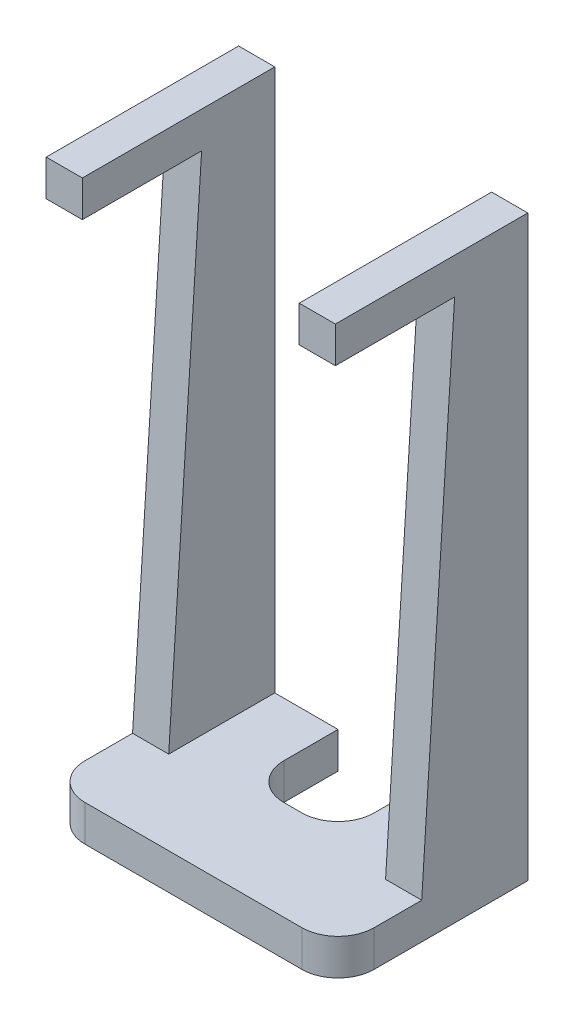
ISO-10303-21;
HEADER;
FILE_DESCRIPTION(('STEP AP214'),'2;1');
FILE_NAME('part.step','',(''),(''),'','','');
FILE_SCHEMA(('AUTOMOTIVE_DESIGN { 1 0 10303 214 1 1 1 1 }'));
ENDSEC;
DATA;
#1=APPLICATION_CONTEXT('core data for automotive mechanical design processes');
#2=APPLICATION_PROTOCOL_DEFINITION('international standard','automotive_design',2000,#1);
#3=PRODUCT_CONTEXT('',#1,'mechanical');
#4=PRODUCT('Part','Part','',(#3));
#5=PRODUCT_RELATED_PRODUCT_CATEGORY('part','',(#4));
#6=PRODUCT_DEFINITION_FORMATION('','',#4);
#7=PRODUCT_DEFINITION_CONTEXT('part definition',#1,'design');
#8=PRODUCT_DEFINITION('design','',#6,#7);
#9=PRODUCT_DEFINITION_SHAPE('','',#8);
#10=(LENGTH_UNIT() NAMED_UNIT(*) SI_UNIT(.MILLI.,.METRE.));
#11=(NAMED_UNIT(*) PLANE_ANGLE_UNIT() SI_UNIT($,.RADIAN.));
#12=(NAMED_UNIT(*) SI_UNIT($,.STERADIAN.) SOLID_ANGLE_UNIT());
#13=UNCERTAINTY_MEASURE_WITH_UNIT(LENGTH_MEASURE(1.E-05),#10,'distance_accuracy_value','');
#14=(GEOMETRIC_REPRESENTATION_CONTEXT(3) GLOBAL_UNCERTAINTY_ASSIGNED_CONTEXT((#13)) GLOBAL_UNIT_ASSIGNED_CONTEXT((#10,
#11,#12)) REPRESENTATION_CONTEXT('',''));
#15=CARTESIAN_POINT('',(0.,0.,0.));
#16=DIRECTION('',(0.,0.,1.));
#17=DIRECTION('',(1.,0.,0.));
#18=AXIS2_PLACEMENT_3D('',#15,#16,#17);
#19=CARTESIAN_POINT('',(-8.,2.,-5.25));
#20=DIRECTION('',(0.,0.,1.));
#21=DIRECTION('',(1.,0.,0.));
#22=AXIS2_PLACEMENT_3D('',#19,#20,#21);
#23=PLANE('',#22);
#24=DIRECTION('',(-1.,0.,0.));
#25=VECTOR('',#24,1.);
#26=CARTESIAN_POINT('',(-8.,0.,-5.25));
#27=LINE('',#26,#25);
#28=CARTESIAN_POINT('',(8.,0.,-5.25));
#29=VERTEX_POINT('',#28);
#30=CARTESIAN_POINT('',(2.5,0.,-5.25));
#31=VERTEX_POINT('',#30);
#32=EDGE_CURVE('E207',#29,#31,#27,.T.);
#33=ORIENTED_EDGE('',*,*,#32,.T.);
#34=DIRECTION('',(0.,-1.,0.));
#35=VECTOR('',#34,1.);
#36=CARTESIAN_POINT('',(2.5,32.,-5.25));
#37=LINE('',#36,#35);
#38=CARTESIAN_POINT('',(2.5,2.,-5.25));
#39=VERTEX_POINT('',#38);
#40=EDGE_CURVE('E201',#39,#31,#37,.T.);
#41=ORIENTED_EDGE('',*,*,#40,.F.);
#42=DIRECTION('',(-1.,0.,0.));
#43=VECTOR('',#42,1.);
#44=CARTESIAN_POINT('',(-8.,2.,-5.25));
#45=LINE('',#44,#43);
#46=CARTESIAN_POINT('',(6.,2.,-5.25));
#47=VERTEX_POINT('',#46);
#48=EDGE_CURVE('E514',#47,#39,#45,.T.);
#49=ORIENTED_EDGE('',*,*,#48,.F.);
#50=DIRECTION('',(0.,1.,0.));
#51=VECTOR('',#50,1.);
#52=CARTESIAN_POINT('',(6.,0.,-5.25));
#53=LINE('',#52,#51);
#54=CARTESIAN_POINT('',(6.,32.,-5.25));
#55=VERTEX_POINT('',#54);
#56=EDGE_CURVE('E537',#47,#55,#53,.T.);
#57=ORIENTED_EDGE('',*,*,#56,.T.);
#58=DIRECTION('',(1.,0.,0.));
#59=VECTOR('',#58,1.);
#60=CARTESIAN_POINT('',(6.,32.,-5.25));
#61=LINE('',#60,#59);
#62=CARTESIAN_POINT('',(8.,32.,-5.25));
#63=VERTEX_POINT('',#62);
#64=EDGE_CURVE('E525',#55,#63,#61,.T.);
#65=ORIENTED_EDGE('',*,*,#64,.T.);
#66=DIRECTION('',(0.,-1.,0.));
#67=VECTOR('',#66,1.);
#68=CARTESIAN_POINT('',(8.,2.,-5.25));
#69=LINE('',#68,#67);
#70=EDGE_CURVE('E222',#63,#29,#69,.T.);
#71=ORIENTED_EDGE('',*,*,#70,.T.);
#72=EDGE_LOOP('',(#33,#41,#49,#57,#65,#71));
#73=FACE_BOUND('',#72,.T.);
#74=ADVANCED_FACE('F33',(#73),#23,.F.);
#75=CARTESIAN_POINT('',(8.,2.,-5.25));
#76=DIRECTION('',(-1.,0.,0.));
#77=DIRECTION('',(0.,0.,1.));
#78=AXIS2_PLACEMENT_3D('',#75,#76,#77);
#79=PLANE('',#78);
#80=DIRECTION('',(0.,0.,-1.));
#81=VECTOR('',#80,1.);
#82=CARTESIAN_POINT('',(8.,2.,-5.25));
#83=LINE('',#82,#81);
#84=CARTESIAN_POINT('',(8.,2.,3.25));
#85=VERTEX_POINT('',#84);
#86=CARTESIAN_POINT('',(8.,2.,0.619867391418011));
#87=VERTEX_POINT('',#86);
#88=EDGE_CURVE('E219',#85,#87,#83,.T.);
#89=ORIENTED_EDGE('',*,*,#88,.F.);
#90=DIRECTION('',(0.,-1.,0.));
#91=VECTOR('',#90,1.);
#92=CARTESIAN_POINT('',(8.,2.,3.25));
#93=LINE('',#92,#91);
#94=CARTESIAN_POINT('',(8.,0.,3.25));
#95=VERTEX_POINT('',#94);
#96=EDGE_CURVE('E226',#85,#95,#93,.T.);
#97=ORIENTED_EDGE('',*,*,#96,.T.);
#98=DIRECTION('',(0.,0.,-1.));
#99=VECTOR('',#98,1.);
#100=CARTESIAN_POINT('',(8.,0.,-5.25));
#101=LINE('',#100,#99);
#102=EDGE_CURVE('E208',#95,#29,#101,.T.);
#103=ORIENTED_EDGE('',*,*,#102,.T.);
#104=ORIENTED_EDGE('',*,*,#70,.F.);
#105=DIRECTION('',(0.,0.,1.));
#106=VECTOR('',#105,1.);
#107=CARTESIAN_POINT('',(8.,32.,-5.25));
#108=LINE('',#107,#106);
#109=CARTESIAN_POINT('',(8.,32.,5.39661749546314));
#110=VERTEX_POINT('',#109);
#111=EDGE_CURVE('E544',#63,#110,#108,.T.);
#112=ORIENTED_EDGE('',*,*,#111,.T.);
#113=DIRECTION('',(0.,-1.,0.));
#114=VECTOR('',#113,1.);
#115=CARTESIAN_POINT('',(8.,32.,5.39661749546314));
#116=LINE('',#115,#114);
#117=CARTESIAN_POINT('',(8.,30.,5.39661749546314));
#118=VERTEX_POINT('',#117);
#119=EDGE_CURVE('E541',#110,#118,#116,.T.);
#120=ORIENTED_EDGE('',*,*,#119,.T.);
#121=DIRECTION('',(0.,0.,-1.));
#122=VECTOR('',#121,1.);
#123=CARTESIAN_POINT('',(8.,30.,5.39661749546314));
#124=LINE('',#123,#122);
#125=CARTESIAN_POINT('',(8.,30.,-1.20198912872979));
#126=VERTEX_POINT('',#125);
#127=EDGE_CURVE('E538',#118,#126,#124,.T.);
#128=ORIENTED_EDGE('',*,*,#127,.T.);
#129=DIRECTION('',(0.,-0.997889885736865,0.0649290069542591));
#130=VECTOR('',#129,1.);
#131=CARTESIAN_POINT('',(8.,30.,-1.20198912872979));
#132=LINE('',#131,#130);
#133=EDGE_CURVE('E534',#126,#87,#132,.T.);
#134=ORIENTED_EDGE('',*,*,#133,.T.);
#135=EDGE_LOOP('',(#89,#97,#103,#104,#112,#120,#128,#134));
#136=FACE_BOUND('',#135,.T.);
#137=ADVANCED_FACE('F272',(#136),#79,.F.);
#138=CARTESIAN_POINT('',(-2.5,2.,-5.25));
#139=VERTEX_POINT('',#138);
#140=CARTESIAN_POINT('',(-6.,2.,-5.25));
#141=VERTEX_POINT('',#140);
#142=EDGE_CURVE('E200',#139,#141,#45,.T.);
#143=ORIENTED_EDGE('',*,*,#142,.F.);
#144=DIRECTION('',(0.,-1.,0.));
#145=VECTOR('',#144,1.);
#146=CARTESIAN_POINT('',(-2.5,32.,-5.25));
#147=LINE('',#146,#145);
#148=CARTESIAN_POINT('',(-2.5,0.,-5.25));
#149=VERTEX_POINT('',#148);
#150=EDGE_CURVE('E187',#139,#149,#147,.T.);
#151=ORIENTED_EDGE('',*,*,#150,.T.);
#152=CARTESIAN_POINT('',(-8.,0.,-5.25));
#153=VERTEX_POINT('',#152);
#154=EDGE_CURVE('E197',#149,#153,#27,.T.);
#155=ORIENTED_EDGE('',*,*,#154,.T.);
#156=DIRECTION('',(0.,-1.,0.));
#157=VECTOR('',#156,1.);
#158=CARTESIAN_POINT('',(-8.,2.,-5.25));
#159=LINE('',#158,#157);
#160=CARTESIAN_POINT('',(-8.,32.,-5.25));
#161=VERTEX_POINT('',#160);
#162=EDGE_CURVE('E220',#161,#153,#159,.T.);
#163=ORIENTED_EDGE('',*,*,#162,.F.);
#164=DIRECTION('',(1.,0.,0.));
#165=VECTOR('',#164,1.);
#166=CARTESIAN_POINT('',(-8.,32.,-5.25));
#167=LINE('',#166,#165);
#168=CARTESIAN_POINT('',(-6.,32.,-5.25));
#169=VERTEX_POINT('',#168);
#170=EDGE_CURVE('E566',#161,#169,#167,.T.);
#171=ORIENTED_EDGE('',*,*,#170,.T.);
#172=DIRECTION('',(0.,1.,0.));
#173=VECTOR('',#172,1.);
#174=CARTESIAN_POINT('',(-6.,0.,-5.25));
#175=LINE('',#174,#173);
#176=EDGE_CURVE('E588',#141,#169,#175,.T.);
#177=ORIENTED_EDGE('',*,*,#176,.F.);
#178=EDGE_LOOP('',(#143,#151,#155,#163,#171,#177));
#179=FACE_BOUND('',#178,.T.);
#180=ADVANCED_FACE('F196',(#179),#23,.F.);
#181=CARTESIAN_POINT('',(-8.,2.,-5.25));
#182=DIRECTION('',(1.,0.,0.));
#183=DIRECTION('',(0.,0.,-1.));
#184=AXIS2_PLACEMENT_3D('',#181,#182,#183);
#185=PLANE('',#184);
#186=DIRECTION('',(0.,0.,1.));
#187=VECTOR('',#186,1.);
#188=CARTESIAN_POINT('',(-8.,0.,-5.25));
#189=LINE('',#188,#187);
#190=CARTESIAN_POINT('',(-8.,0.,3.25));
#191=VERTEX_POINT('',#190);
#192=EDGE_CURVE('E206',#153,#191,#189,.T.);
#193=ORIENTED_EDGE('',*,*,#192,.T.);
#194=DIRECTION('',(0.,-1.,0.));
#195=VECTOR('',#194,1.);
#196=CARTESIAN_POINT('',(-8.,2.,3.25));
#197=LINE('',#196,#195);
#198=CARTESIAN_POINT('',(-8.,2.,3.25));
#199=VERTEX_POINT('',#198);
#200=EDGE_CURVE('E48',#191,#199,#197,.F.);
#201=ORIENTED_EDGE('',*,*,#200,.T.);
#202=DIRECTION('',(0.,0.,1.));
#203=VECTOR('',#202,1.);
#204=CARTESIAN_POINT('',(-8.,2.,-5.25));
#205=LINE('',#204,#203);
#206=CARTESIAN_POINT('',(-8.,2.,0.619867391418011));
#207=VERTEX_POINT('',#206);
#208=EDGE_CURVE('E511',#207,#199,#205,.T.);
#209=ORIENTED_EDGE('',*,*,#208,.F.);
#210=DIRECTION('',(0.,-0.997889885736865,0.0649290069542591));
#211=VECTOR('',#210,1.);
#212=CARTESIAN_POINT('',(-8.,30.,-1.20198912872979));
#213=LINE('',#212,#211);
#214=CARTESIAN_POINT('',(-8.,30.,-1.20198912872979));
#215=VERTEX_POINT('',#214);
#216=EDGE_CURVE('E570',#215,#207,#213,.T.);
#217=ORIENTED_EDGE('',*,*,#216,.F.);
#218=DIRECTION('',(0.,0.,-1.));
#219=VECTOR('',#218,1.);
#220=CARTESIAN_POINT('',(-8.,30.,5.39661749546314));
#221=LINE('',#220,#219);
#222=CARTESIAN_POINT('',(-8.,30.,5.39661749546314));
#223=VERTEX_POINT('',#222);
#224=EDGE_CURVE('E593',#223,#215,#221,.T.);
#225=ORIENTED_EDGE('',*,*,#224,.F.);
#226=DIRECTION('',(0.,-1.,0.));
#227=VECTOR('',#226,1.);
#228=CARTESIAN_POINT('',(-8.,32.,5.39661749546314));
#229=LINE('',#228,#227);
#230=CARTESIAN_POINT('',(-8.,32.,5.39661749546314));
#231=VERTEX_POINT('',#230);
#232=EDGE_CURVE('E596',#231,#223,#229,.T.);
#233=ORIENTED_EDGE('',*,*,#232,.F.);
#234=DIRECTION('',(0.,0.,1.));
#235=VECTOR('',#234,1.);
#236=CARTESIAN_POINT('',(-8.,32.,-5.25));
#237=LINE('',#236,#235);
#238=EDGE_CURVE('E578',#161,#231,#237,.T.);
#239=ORIENTED_EDGE('',*,*,#238,.F.);
#240=ORIENTED_EDGE('',*,*,#162,.T.);
#241=EDGE_LOOP('',(#193,#201,#209,#217,#225,#233,#239,#240));
#242=FACE_BOUND('',#241,.T.);
#243=ADVANCED_FACE('F282',(#242),#185,.F.);
#244=CARTESIAN_POINT('',(-8.,2.,5.25));
#245=DIRECTION('',(0.,0.,-1.));
#246=DIRECTION('',(-1.,0.,0.));
#247=AXIS2_PLACEMENT_3D('',#244,#245,#246);
#248=PLANE('',#247);
#249=DIRECTION('',(1.,0.,0.));
#250=VECTOR('',#249,1.);
#251=CARTESIAN_POINT('',(-8.,0.,5.25));
#252=LINE('',#251,#250);
#253=CARTESIAN_POINT('',(-6.,0.,5.25));
#254=VERTEX_POINT('',#253);
#255=CARTESIAN_POINT('',(6.,0.,5.25));
#256=VERTEX_POINT('',#255);
#257=EDGE_CURVE('E216',#254,#256,#252,.T.);
#258=ORIENTED_EDGE('',*,*,#257,.T.);
#259=DIRECTION('',(0.,-1.,0.));
#260=VECTOR('',#259,1.);
#261=CARTESIAN_POINT('',(6.,2.,5.25));
#262=LINE('',#261,#260);
#263=CARTESIAN_POINT('',(6.,2.,5.25));
#264=VERTEX_POINT('',#263);
#265=EDGE_CURVE('E236',#256,#264,#262,.F.);
#266=ORIENTED_EDGE('',*,*,#265,.T.);
#267=DIRECTION('',(1.,0.,0.));
#268=VECTOR('',#267,1.);
#269=CARTESIAN_POINT('',(-8.,2.,5.25));
#270=LINE('',#269,#268);
#271=CARTESIAN_POINT('',(-6.,2.,5.25));
#272=VERTEX_POINT('',#271);
#273=EDGE_CURVE('E223',#272,#264,#270,.T.);
#274=ORIENTED_EDGE('',*,*,#273,.F.);
#275=DIRECTION('',(0.,-1.,0.));
#276=VECTOR('',#275,1.);
#277=CARTESIAN_POINT('',(-6.,2.,5.25));
#278=LINE('',#277,#276);
#279=EDGE_CURVE('E233',#272,#254,#278,.T.);
#280=ORIENTED_EDGE('',*,*,#279,.T.);
#281=EDGE_LOOP('',(#258,#266,#274,#280));
#282=FACE_BOUND('',#281,.T.);
#283=ADVANCED_FACE('F286',(#282),#248,.F.);
#284=CARTESIAN_POINT('',(0.,2.,0.));
#285=DIRECTION('',(0.,1.,0.));
#286=DIRECTION('',(0.,0.,1.));
#287=AXIS2_PLACEMENT_3D('',#284,#285,#286);
#288=PLANE('',#287);
#289=ORIENTED_EDGE('',*,*,#273,.T.);
#290=CARTESIAN_POINT('',(6.,2.,3.25));
#291=DIRECTION('',(0.,1.,0.));
#292=DIRECTION('',(0.,0.,1.));
#293=AXIS2_PLACEMENT_3D('',#290,#291,#292);
#294=CIRCLE('',#293,2.);
#295=EDGE_CURVE('E240',#264,#85,#294,.T.);
#296=ORIENTED_EDGE('',*,*,#295,.T.);
#297=ORIENTED_EDGE('',*,*,#88,.T.);
#298=DIRECTION('',(1.,0.,0.));
#299=VECTOR('',#298,1.);
#300=CARTESIAN_POINT('',(0.,2.,0.619867391418013));
#301=LINE('',#300,#299);
#302=CARTESIAN_POINT('',(6.,2.,0.619867391418013));
#303=VERTEX_POINT('',#302);
#304=EDGE_CURVE('E211',#303,#87,#301,.T.);
#305=ORIENTED_EDGE('',*,*,#304,.F.);
#306=DIRECTION('',(0.,0.,-1.));
#307=VECTOR('',#306,1.);
#308=CARTESIAN_POINT('',(6.,2.,0.));
#309=LINE('',#308,#307);
#310=EDGE_CURVE('E522',#303,#47,#309,.T.);
#311=ORIENTED_EDGE('',*,*,#310,.T.);
#312=ORIENTED_EDGE('',*,*,#48,.T.);
#313=DIRECTION('',(0.,0.,-1.));
#314=VECTOR('',#313,1.);
#315=CARTESIAN_POINT('',(2.5,2.,0.));
#316=LINE('',#315,#314);
#317=CARTESIAN_POINT('',(2.5,2.,-2.25));
#318=VERTEX_POINT('',#317);
#319=EDGE_CURVE('E590',#318,#39,#316,.T.);
#320=ORIENTED_EDGE('',*,*,#319,.F.);
#321=CARTESIAN_POINT('',(0.5,2.,-2.25));
#322=DIRECTION('',(0.,1.,0.));
#323=DIRECTION('',(0.,0.,1.));
#324=AXIS2_PLACEMENT_3D('',#321,#322,#323);
#325=CIRCLE('',#324,2.);
#326=CARTESIAN_POINT('',(0.5,2.,-0.250000000000001));
#327=VERTEX_POINT('',#326);
#328=EDGE_CURVE('E253',#318,#327,#325,.F.);
#329=ORIENTED_EDGE('',*,*,#328,.T.);
#330=DIRECTION('',(1.,0.,0.));
#331=VECTOR('',#330,1.);
#332=CARTESIAN_POINT('',(0.,2.,-0.250000000000001));
#333=LINE('',#332,#331);
#334=CARTESIAN_POINT('',(-0.5,2.,-0.250000000000001));
#335=VERTEX_POINT('',#334);
#336=EDGE_CURVE('E604',#335,#327,#333,.T.);
#337=ORIENTED_EDGE('',*,*,#336,.F.);
#338=CARTESIAN_POINT('',(-0.5,2.,-2.25));
#339=DIRECTION('',(0.,1.,0.));
#340=DIRECTION('',(0.,0.,1.));
#341=AXIS2_PLACEMENT_3D('',#338,#339,#340);
#342=CIRCLE('',#341,2.);
#343=CARTESIAN_POINT('',(-2.5,2.,-2.25));
#344=VERTEX_POINT('',#343);
#345=EDGE_CURVE('E11',#335,#344,#342,.F.);
#346=ORIENTED_EDGE('',*,*,#345,.T.);
#347=DIRECTION('',(0.,0.,1.));
#348=VECTOR('',#347,1.);
#349=CARTESIAN_POINT('',(-2.5,2.,0.));
#350=LINE('',#349,#348);
#351=EDGE_CURVE('E602',#139,#344,#350,.T.);
#352=ORIENTED_EDGE('',*,*,#351,.F.);
#353=ORIENTED_EDGE('',*,*,#142,.T.);
#354=DIRECTION('',(0.,0.,-1.));
#355=VECTOR('',#354,1.);
#356=CARTESIAN_POINT('',(-6.,2.,0.));
#357=LINE('',#356,#355);
#358=CARTESIAN_POINT('',(-6.,2.,0.619867391418013));
#359=VERTEX_POINT('',#358);
#360=EDGE_CURVE('E562',#359,#141,#357,.T.);
#361=ORIENTED_EDGE('',*,*,#360,.F.);
#362=DIRECTION('',(1.,0.,0.));
#363=VECTOR('',#362,1.);
#364=CARTESIAN_POINT('',(0.,2.,0.619867391418013));
#365=LINE('',#364,#363);
#366=EDGE_CURVE('E547',#207,#359,#365,.T.);
#367=ORIENTED_EDGE('',*,*,#366,.F.);
#368=ORIENTED_EDGE('',*,*,#208,.T.);
#369=CARTESIAN_POINT('',(-6.,2.,3.25));
#370=DIRECTION('',(0.,1.,0.));
#371=DIRECTION('',(0.,0.,1.));
#372=AXIS2_PLACEMENT_3D('',#369,#370,#371);
#373=CIRCLE('',#372,2.);
#374=EDGE_CURVE('E238',#199,#272,#373,.T.);
#375=ORIENTED_EDGE('',*,*,#374,.T.);
#376=EDGE_LOOP('',(#289,#296,#297,#305,#311,#312,#320,#329,#337,#346,#352,#353,#361,#367,#368,#375));
#377=FACE_BOUND('',#376,.T.);
#378=ADVANCED_FACE('F290',(#377),#288,.T.);
#379=CARTESIAN_POINT('',(0.,0.,0.));
#380=DIRECTION('',(0.,1.,0.));
#381=DIRECTION('',(0.,0.,1.));
#382=AXIS2_PLACEMENT_3D('',#379,#380,#381);
#383=PLANE('',#382);
#384=ORIENTED_EDGE('',*,*,#102,.F.);
#385=CARTESIAN_POINT('',(6.,0.,3.25));
#386=DIRECTION('',(0.,1.,0.));
#387=DIRECTION('',(0.,0.,1.));
#388=AXIS2_PLACEMENT_3D('',#385,#386,#387);
#389=CIRCLE('',#388,2.);
#390=EDGE_CURVE('E231',#95,#256,#389,.F.);
#391=ORIENTED_EDGE('',*,*,#390,.T.);
#392=ORIENTED_EDGE('',*,*,#257,.F.);
#393=CARTESIAN_POINT('',(-6.,0.,3.25));
#394=DIRECTION('',(0.,1.,0.));
#395=DIRECTION('',(0.,0.,1.));
#396=AXIS2_PLACEMENT_3D('',#393,#394,#395);
#397=CIRCLE('',#396,2.);
#398=EDGE_CURVE('E229',#254,#191,#397,.F.);
#399=ORIENTED_EDGE('',*,*,#398,.T.);
#400=ORIENTED_EDGE('',*,*,#192,.F.);
#401=ORIENTED_EDGE('',*,*,#154,.F.);
#402=DIRECTION('',(0.,0.,-1.));
#403=VECTOR('',#402,1.);
#404=CARTESIAN_POINT('',(-2.5,0.,-0.250000000000001));
#405=LINE('',#404,#403);
#406=CARTESIAN_POINT('',(-2.5,0.,-2.25));
#407=VERTEX_POINT('',#406);
#408=EDGE_CURVE('E184',#407,#149,#405,.T.);
#409=ORIENTED_EDGE('',*,*,#408,.F.);
#410=CARTESIAN_POINT('',(-0.5,0.,-2.25));
#411=DIRECTION('',(0.,1.,0.));
#412=DIRECTION('',(0.,0.,1.));
#413=AXIS2_PLACEMENT_3D('',#410,#411,#412);
#414=CIRCLE('',#413,2.);
#415=CARTESIAN_POINT('',(-0.5,0.,-0.250000000000001));
#416=VERTEX_POINT('',#415);
#417=EDGE_CURVE('E41',#407,#416,#414,.T.);
#418=ORIENTED_EDGE('',*,*,#417,.T.);
#419=DIRECTION('',(-1.,0.,0.));
#420=VECTOR('',#419,1.);
#421=CARTESIAN_POINT('',(-2.5,0.,-0.250000000000001));
#422=LINE('',#421,#420);
#423=CARTESIAN_POINT('',(0.5,0.,-0.250000000000001));
#424=VERTEX_POINT('',#423);
#425=EDGE_CURVE('E192',#424,#416,#422,.T.);
#426=ORIENTED_EDGE('',*,*,#425,.F.);
#427=CARTESIAN_POINT('',(0.5,0.,-2.25));
#428=DIRECTION('',(0.,1.,0.));
#429=DIRECTION('',(0.,0.,1.));
#430=AXIS2_PLACEMENT_3D('',#427,#428,#429);
#431=CIRCLE('',#430,2.);
#432=CARTESIAN_POINT('',(2.5,0.,-2.25));
#433=VERTEX_POINT('',#432);
#434=EDGE_CURVE('E251',#424,#433,#431,.T.);
#435=ORIENTED_EDGE('',*,*,#434,.T.);
#436=DIRECTION('',(0.,0.,1.));
#437=VECTOR('',#436,1.);
#438=CARTESIAN_POINT('',(2.5,0.,-0.250000000000001));
#439=LINE('',#438,#437);
#440=EDGE_CURVE('E262',#31,#433,#439,.T.);
#441=ORIENTED_EDGE('',*,*,#440,.F.);
#442=ORIENTED_EDGE('',*,*,#32,.F.);
#443=EDGE_LOOP('',(#384,#391,#392,#399,#400,#401,#409,#418,#426,#435,#441,#442));
#444=FACE_BOUND('',#443,.T.);
#445=ADVANCED_FACE('F205',(#444),#383,.F.);
#446=CARTESIAN_POINT('',(6.,30.,-1.20198912872979));
#447=DIRECTION('',(0.,0.0649290069542591,0.997889885736865));
#448=DIRECTION('',(0.,-0.997889885736865,0.0649290069542591));
#449=AXIS2_PLACEMENT_3D('',#446,#447,#448);
#450=PLANE('',#449);
#451=DIRECTION('',(0.,-0.997889885736865,0.0649290069542591));
#452=VECTOR('',#451,1.);
#453=CARTESIAN_POINT('',(6.,30.,-1.20198912872979));
#454=LINE('',#453,#452);
#455=CARTESIAN_POINT('',(6.,30.,-1.20198912872979));
#456=VERTEX_POINT('',#455);
#457=EDGE_CURVE('E529',#456,#303,#454,.T.);
#458=ORIENTED_EDGE('',*,*,#457,.T.);
#459=ORIENTED_EDGE('',*,*,#304,.T.);
#460=ORIENTED_EDGE('',*,*,#133,.F.);
#461=DIRECTION('',(1.,0.,0.));
#462=VECTOR('',#461,1.);
#463=CARTESIAN_POINT('',(6.,30.,-1.20198912872979));
#464=LINE('',#463,#462);
#465=EDGE_CURVE('E524',#456,#126,#464,.T.);
#466=ORIENTED_EDGE('',*,*,#465,.F.);
#467=EDGE_LOOP('',(#458,#459,#460,#466));
#468=FACE_BOUND('',#467,.T.);
#469=ADVANCED_FACE('F296',(#468),#450,.T.);
#470=CARTESIAN_POINT('',(6.,30.,5.39661749546314));
#471=DIRECTION('',(0.,-1.,0.));
#472=DIRECTION('',(0.,0.,-1.));
#473=AXIS2_PLACEMENT_3D('',#470,#471,#472);
#474=PLANE('',#473);
#475=ORIENTED_EDGE('',*,*,#127,.F.);
#476=DIRECTION('',(1.,0.,0.));
#477=VECTOR('',#476,1.);
#478=CARTESIAN_POINT('',(6.,30.,5.39661749546314));
#479=LINE('',#478,#477);
#480=CARTESIAN_POINT('',(6.,30.,5.39661749546314));
#481=VERTEX_POINT('',#480);
#482=EDGE_CURVE('E531',#481,#118,#479,.T.);
#483=ORIENTED_EDGE('',*,*,#482,.F.);
#484=DIRECTION('',(0.,0.,-1.));
#485=VECTOR('',#484,1.);
#486=CARTESIAN_POINT('',(6.,30.,5.39661749546314));
#487=LINE('',#486,#485);
#488=EDGE_CURVE('E550',#481,#456,#487,.T.);
#489=ORIENTED_EDGE('',*,*,#488,.T.);
#490=ORIENTED_EDGE('',*,*,#465,.T.);
#491=EDGE_LOOP('',(#475,#483,#489,#490));
#492=FACE_BOUND('',#491,.T.);
#493=ADVANCED_FACE('F307',(#492),#474,.T.);
#494=CARTESIAN_POINT('',(6.,32.,5.39661749546314));
#495=DIRECTION('',(0.,0.,1.));
#496=DIRECTION('',(1.,0.,0.));
#497=AXIS2_PLACEMENT_3D('',#494,#495,#496);
#498=PLANE('',#497);
#499=ORIENTED_EDGE('',*,*,#119,.F.);
#500=DIRECTION('',(1.,0.,0.));
#501=VECTOR('',#500,1.);
#502=CARTESIAN_POINT('',(6.,32.,5.39661749546314));
#503=LINE('',#502,#501);
#504=CARTESIAN_POINT('',(6.,32.,5.39661749546314));
#505=VERTEX_POINT('',#504);
#506=EDGE_CURVE('E528',#505,#110,#503,.T.);
#507=ORIENTED_EDGE('',*,*,#506,.F.);
#508=DIRECTION('',(0.,-1.,0.));
#509=VECTOR('',#508,1.);
#510=CARTESIAN_POINT('',(6.,32.,5.39661749546314));
#511=LINE('',#510,#509);
#512=EDGE_CURVE('E553',#505,#481,#511,.T.);
#513=ORIENTED_EDGE('',*,*,#512,.T.);
#514=ORIENTED_EDGE('',*,*,#482,.T.);
#515=EDGE_LOOP('',(#499,#507,#513,#514));
#516=FACE_BOUND('',#515,.T.);
#517=ADVANCED_FACE('F303',(#516),#498,.T.);
#518=CARTESIAN_POINT('',(6.,32.,-5.25));
#519=DIRECTION('',(0.,1.,0.));
#520=DIRECTION('',(0.,0.,1.));
#521=AXIS2_PLACEMENT_3D('',#518,#519,#520);
#522=PLANE('',#521);
#523=ORIENTED_EDGE('',*,*,#111,.F.);
#524=ORIENTED_EDGE('',*,*,#64,.F.);
#525=DIRECTION('',(0.,0.,1.));
#526=VECTOR('',#525,1.);
#527=CARTESIAN_POINT('',(6.,32.,-5.25));
#528=LINE('',#527,#526);
#529=EDGE_CURVE('E556',#55,#505,#528,.T.);
#530=ORIENTED_EDGE('',*,*,#529,.T.);
#531=ORIENTED_EDGE('',*,*,#506,.T.);
#532=EDGE_LOOP('',(#523,#524,#530,#531));
#533=FACE_BOUND('',#532,.T.);
#534=ADVANCED_FACE('F299',(#533),#522,.T.);
#535=CARTESIAN_POINT('',(6.,0.,0.));
#536=DIRECTION('',(1.,0.,0.));
#537=DIRECTION('',(0.,0.,-1.));
#538=AXIS2_PLACEMENT_3D('',#535,#536,#537);
#539=PLANE('',#538);
#540=ORIENTED_EDGE('',*,*,#310,.F.);
#541=ORIENTED_EDGE('',*,*,#457,.F.);
#542=ORIENTED_EDGE('',*,*,#488,.F.);
#543=ORIENTED_EDGE('',*,*,#512,.F.);
#544=ORIENTED_EDGE('',*,*,#529,.F.);
#545=ORIENTED_EDGE('',*,*,#56,.F.);
#546=EDGE_LOOP('',(#540,#541,#542,#543,#544,#545));
#547=FACE_BOUND('',#546,.T.);
#548=ADVANCED_FACE('F302',(#547),#539,.F.);
#549=CARTESIAN_POINT('',(-8.,30.,-1.20198912872979));
#550=DIRECTION('',(0.,0.0649290069542591,0.997889885736865));
#551=DIRECTION('',(0.,-0.997889885736865,0.0649290069542591));
#552=AXIS2_PLACEMENT_3D('',#549,#550,#551);
#553=PLANE('',#552);
#554=ORIENTED_EDGE('',*,*,#216,.T.);
#555=ORIENTED_EDGE('',*,*,#366,.T.);
#556=DIRECTION('',(0.,-0.997889885736865,0.0649290069542591));
#557=VECTOR('',#556,1.);
#558=CARTESIAN_POINT('',(-6.,30.,-1.20198912872979));
#559=LINE('',#558,#557);
#560=CARTESIAN_POINT('',(-6.,30.,-1.20198912872979));
#561=VERTEX_POINT('',#560);
#562=EDGE_CURVE('E575',#561,#359,#559,.T.);
#563=ORIENTED_EDGE('',*,*,#562,.F.);
#564=DIRECTION('',(1.,0.,0.));
#565=VECTOR('',#564,1.);
#566=CARTESIAN_POINT('',(-8.,30.,-1.20198912872979));
#567=LINE('',#566,#565);
#568=EDGE_CURVE('E565',#215,#561,#567,.T.);
#569=ORIENTED_EDGE('',*,*,#568,.F.);
#570=EDGE_LOOP('',(#554,#555,#563,#569));
#571=FACE_BOUND('',#570,.T.);
#572=ADVANCED_FACE('F317',(#571),#553,.T.);
#573=CARTESIAN_POINT('',(-8.,30.,5.39661749546314));
#574=DIRECTION('',(0.,-1.,0.));
#575=DIRECTION('',(0.,0.,-1.));
#576=AXIS2_PLACEMENT_3D('',#573,#574,#575);
#577=PLANE('',#576);
#578=DIRECTION('',(0.,0.,-1.));
#579=VECTOR('',#578,1.);
#580=CARTESIAN_POINT('',(-6.,30.,5.39661749546314));
#581=LINE('',#580,#579);
#582=CARTESIAN_POINT('',(-6.,30.,5.39661749546314));
#583=VERTEX_POINT('',#582);
#584=EDGE_CURVE('E579',#583,#561,#581,.T.);
#585=ORIENTED_EDGE('',*,*,#584,.F.);
#586=DIRECTION('',(1.,0.,0.));
#587=VECTOR('',#586,1.);
#588=CARTESIAN_POINT('',(-8.,30.,5.39661749546314));
#589=LINE('',#588,#587);
#590=EDGE_CURVE('E572',#223,#583,#589,.T.);
#591=ORIENTED_EDGE('',*,*,#590,.F.);
#592=ORIENTED_EDGE('',*,*,#224,.T.);
#593=ORIENTED_EDGE('',*,*,#568,.T.);
#594=EDGE_LOOP('',(#585,#591,#592,#593));
#595=FACE_BOUND('',#594,.T.);
#596=ADVANCED_FACE('F327',(#595),#577,.T.);
#597=CARTESIAN_POINT('',(-8.,32.,5.39661749546314));
#598=DIRECTION('',(0.,0.,1.));
#599=DIRECTION('',(1.,0.,0.));
#600=AXIS2_PLACEMENT_3D('',#597,#598,#599);
#601=PLANE('',#600);
#602=DIRECTION('',(0.,-1.,0.));
#603=VECTOR('',#602,1.);
#604=CARTESIAN_POINT('',(-6.,32.,5.39661749546314));
#605=LINE('',#604,#603);
#606=CARTESIAN_POINT('',(-6.,32.,5.39661749546314));
#607=VERTEX_POINT('',#606);
#608=EDGE_CURVE('E582',#607,#583,#605,.T.);
#609=ORIENTED_EDGE('',*,*,#608,.F.);
#610=DIRECTION('',(1.,0.,0.));
#611=VECTOR('',#610,1.);
#612=CARTESIAN_POINT('',(-8.,32.,5.39661749546314));
#613=LINE('',#612,#611);
#614=EDGE_CURVE('E569',#231,#607,#613,.T.);
#615=ORIENTED_EDGE('',*,*,#614,.F.);
#616=ORIENTED_EDGE('',*,*,#232,.T.);
#617=ORIENTED_EDGE('',*,*,#590,.T.);
#618=EDGE_LOOP('',(#609,#615,#616,#617));
#619=FACE_BOUND('',#618,.T.);
#620=ADVANCED_FACE('F323',(#619),#601,.T.);
#621=CARTESIAN_POINT('',(-8.,32.,-5.25));
#622=DIRECTION('',(0.,1.,0.));
#623=DIRECTION('',(0.,0.,1.));
#624=AXIS2_PLACEMENT_3D('',#621,#622,#623);
#625=PLANE('',#624);
#626=DIRECTION('',(0.,0.,1.));
#627=VECTOR('',#626,1.);
#628=CARTESIAN_POINT('',(-6.,32.,-5.25));
#629=LINE('',#628,#627);
#630=EDGE_CURVE('E585',#169,#607,#629,.T.);
#631=ORIENTED_EDGE('',*,*,#630,.F.);
#632=ORIENTED_EDGE('',*,*,#170,.F.);
#633=ORIENTED_EDGE('',*,*,#238,.T.);
#634=ORIENTED_EDGE('',*,*,#614,.T.);
#635=EDGE_LOOP('',(#631,#632,#633,#634));
#636=FACE_BOUND('',#635,.T.);
#637=ADVANCED_FACE('F319',(#636),#625,.T.);
#638=CARTESIAN_POINT('',(-6.,0.,0.));
#639=DIRECTION('',(1.,0.,0.));
#640=DIRECTION('',(0.,0.,-1.));
#641=AXIS2_PLACEMENT_3D('',#638,#639,#640);
#642=PLANE('',#641);
#643=ORIENTED_EDGE('',*,*,#562,.T.);
#644=ORIENTED_EDGE('',*,*,#360,.T.);
#645=ORIENTED_EDGE('',*,*,#176,.T.);
#646=ORIENTED_EDGE('',*,*,#630,.T.);
#647=ORIENTED_EDGE('',*,*,#608,.T.);
#648=ORIENTED_EDGE('',*,*,#584,.T.);
#649=EDGE_LOOP('',(#643,#644,#645,#646,#647,#648));
#650=FACE_BOUND('',#649,.T.);
#651=ADVANCED_FACE('F322',(#650),#642,.T.);
#652=CARTESIAN_POINT('',(2.5,32.,-0.250000000000001));
#653=DIRECTION('',(1.,0.,0.));
#654=DIRECTION('',(0.,0.,-1.));
#655=AXIS2_PLACEMENT_3D('',#652,#653,#654);
#656=PLANE('',#655);
#657=ORIENTED_EDGE('',*,*,#440,.T.);
#658=DIRECTION('',(0.,-1.,0.));
#659=VECTOR('',#658,1.);
#660=CARTESIAN_POINT('',(2.5,2.,-2.25));
#661=LINE('',#660,#659);
#662=EDGE_CURVE('E248',#433,#318,#661,.F.);
#663=ORIENTED_EDGE('',*,*,#662,.T.);
#664=ORIENTED_EDGE('',*,*,#319,.T.);
#665=ORIENTED_EDGE('',*,*,#40,.T.);
#666=EDGE_LOOP('',(#657,#663,#664,#665));
#667=FACE_BOUND('',#666,.T.);
#668=ADVANCED_FACE('F337',(#667),#656,.F.);
#669=CARTESIAN_POINT('',(-2.5,32.,-0.250000000000001));
#670=DIRECTION('',(-1.,0.,0.));
#671=DIRECTION('',(0.,0.,1.));
#672=AXIS2_PLACEMENT_3D('',#669,#670,#671);
#673=PLANE('',#672);
#674=ORIENTED_EDGE('',*,*,#351,.T.);
#675=DIRECTION('',(0.,-1.,0.));
#676=VECTOR('',#675,1.);
#677=CARTESIAN_POINT('',(-2.5,0.,-2.25));
#678=LINE('',#677,#676);
#679=EDGE_CURVE('E189',#344,#407,#678,.T.);
#680=ORIENTED_EDGE('',*,*,#679,.T.);
#681=ORIENTED_EDGE('',*,*,#408,.T.);
#682=ORIENTED_EDGE('',*,*,#150,.F.);
#683=EDGE_LOOP('',(#674,#680,#681,#682));
#684=FACE_BOUND('',#683,.T.);
#685=ADVANCED_FACE('F186',(#684),#673,.F.);
#686=CARTESIAN_POINT('',(-2.5,32.,-0.250000000000001));
#687=DIRECTION('',(0.,0.,1.));
#688=DIRECTION('',(1.,0.,0.));
#689=AXIS2_PLACEMENT_3D('',#686,#687,#688);
#690=PLANE('',#689);
#691=ORIENTED_EDGE('',*,*,#336,.T.);
#692=DIRECTION('',(0.,-1.,0.));
#693=VECTOR('',#692,1.);
#694=CARTESIAN_POINT('',(0.5,0.,-0.250000000000001));
#695=LINE('',#694,#693);
#696=EDGE_CURVE('E245',#327,#424,#695,.T.);
#697=ORIENTED_EDGE('',*,*,#696,.T.);
#698=ORIENTED_EDGE('',*,*,#425,.T.);
#699=DIRECTION('',(0.,-1.,0.));
#700=VECTOR('',#699,1.);
#701=CARTESIAN_POINT('',(-0.5,2.,-0.250000000000001));
#702=LINE('',#701,#700);
#703=EDGE_CURVE('E243',#416,#335,#702,.F.);
#704=ORIENTED_EDGE('',*,*,#703,.T.);
#705=EDGE_LOOP('',(#691,#697,#698,#704));
#706=FACE_BOUND('',#705,.T.);
#707=ADVANCED_FACE('F260',(#706),#690,.F.);
#708=CARTESIAN_POINT('',(6.,2.,3.25));
#709=DIRECTION('',(0.,-1.,0.));
#710=DIRECTION('',(0.,0.,-1.));
#711=AXIS2_PLACEMENT_3D('',#708,#709,#710);
#712=CYLINDRICAL_SURFACE('',#711,2.);
#713=ORIENTED_EDGE('',*,*,#295,.F.);
#714=ORIENTED_EDGE('',*,*,#265,.F.);
#715=ORIENTED_EDGE('',*,*,#390,.F.);
#716=ORIENTED_EDGE('',*,*,#96,.F.);
#717=EDGE_LOOP('',(#713,#714,#715,#716));
#718=FACE_BOUND('',#717,.T.);
#719=ADVANCED_FACE('F344',(#718),#712,.T.);
#720=CARTESIAN_POINT('',(-6.,2.,3.25));
#721=DIRECTION('',(0.,-1.,0.));
#722=DIRECTION('',(0.,0.,-1.));
#723=AXIS2_PLACEMENT_3D('',#720,#721,#722);
#724=CYLINDRICAL_SURFACE('',#723,2.);
#725=ORIENTED_EDGE('',*,*,#374,.F.);
#726=ORIENTED_EDGE('',*,*,#200,.F.);
#727=ORIENTED_EDGE('',*,*,#398,.F.);
#728=ORIENTED_EDGE('',*,*,#279,.F.);
#729=EDGE_LOOP('',(#725,#726,#727,#728));
#730=FACE_BOUND('',#729,.T.);
#731=ADVANCED_FACE('F269',(#730),#724,.T.);
#732=CARTESIAN_POINT('',(0.5,32.,-2.25));
#733=DIRECTION('',(0.,1.,0.));
#734=DIRECTION('',(0.,0.,1.));
#735=AXIS2_PLACEMENT_3D('',#732,#733,#734);
#736=CYLINDRICAL_SURFACE('',#735,2.);
#737=ORIENTED_EDGE('',*,*,#328,.F.);
#738=ORIENTED_EDGE('',*,*,#662,.F.);
#739=ORIENTED_EDGE('',*,*,#434,.F.);
#740=ORIENTED_EDGE('',*,*,#696,.F.);
#741=EDGE_LOOP('',(#737,#738,#739,#740));
#742=FACE_BOUND('',#741,.T.);
#743=ADVANCED_FACE('F265',(#742),#736,.F.);
#744=CARTESIAN_POINT('',(-0.5,32.,-2.25));
#745=DIRECTION('',(0.,1.,0.));
#746=DIRECTION('',(0.,0.,1.));
#747=AXIS2_PLACEMENT_3D('',#744,#745,#746);
#748=CYLINDRICAL_SURFACE('',#747,2.);
#749=ORIENTED_EDGE('',*,*,#345,.F.);
#750=ORIENTED_EDGE('',*,*,#703,.F.);
#751=ORIENTED_EDGE('',*,*,#417,.F.);
#752=ORIENTED_EDGE('',*,*,#679,.F.);
#753=EDGE_LOOP('',(#749,#750,#751,#752));
#754=FACE_BOUND('',#753,.T.);
#755=ADVANCED_FACE('F35',(#754),#748,.F.);
#756=CLOSED_SHELL('',(#74,#137,#180,#243,#283,#378,#445,#469,#493,#517,#534,#548,#572,#596,#620,
#637,#651,#668,#685,#707,#719,#731,#743,#755));
#757=MANIFOLD_SOLID_BREP('B2',#756);
#758=ADVANCED_BREP_SHAPE_REPRESENTATION('',(#18,#757),#14);
#759=SHAPE_DEFINITION_REPRESENTATION(#9,#758);
ENDSEC;
END-ISO-10303-21;
